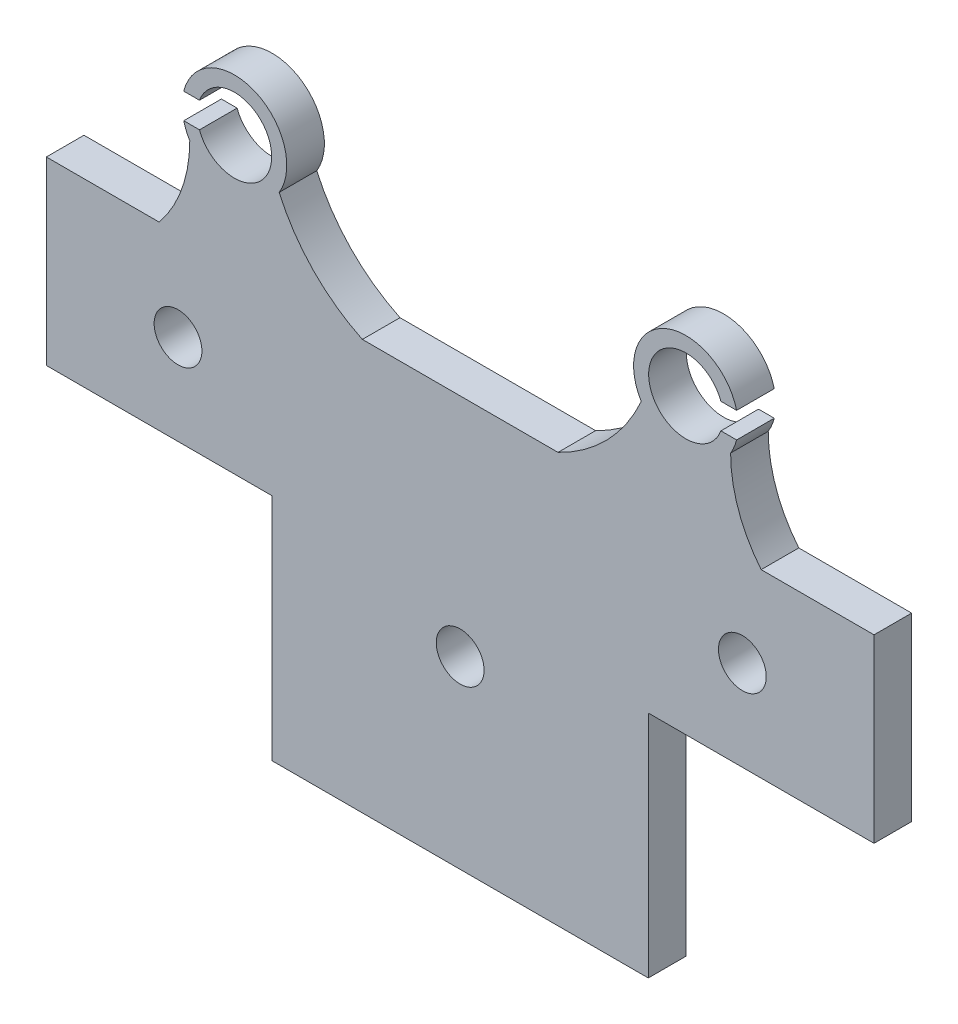
ISO-10303-21;
HEADER;
FILE_DESCRIPTION(('STEP AP214'),'2;1');
FILE_NAME('part.step','',(''),(''),'','','');
FILE_SCHEMA(('AUTOMOTIVE_DESIGN { 1 0 10303 214 1 1 1 1 }'));
ENDSEC;
DATA;
#1=APPLICATION_CONTEXT('core data for automotive mechanical design processes');
#2=APPLICATION_PROTOCOL_DEFINITION('international standard','automotive_design',2000,#1);
#3=PRODUCT_CONTEXT('',#1,'mechanical');
#4=PRODUCT('Part','Part','',(#3));
#5=PRODUCT_RELATED_PRODUCT_CATEGORY('part','',(#4));
#6=PRODUCT_DEFINITION_FORMATION('','',#4);
#7=PRODUCT_DEFINITION_CONTEXT('part definition',#1,'design');
#8=PRODUCT_DEFINITION('design','',#6,#7);
#9=PRODUCT_DEFINITION_SHAPE('','',#8);
#10=(LENGTH_UNIT() NAMED_UNIT(*) SI_UNIT(.MILLI.,.METRE.));
#11=(NAMED_UNIT(*) PLANE_ANGLE_UNIT() SI_UNIT($,.RADIAN.));
#12=(NAMED_UNIT(*) SI_UNIT($,.STERADIAN.) SOLID_ANGLE_UNIT());
#13=UNCERTAINTY_MEASURE_WITH_UNIT(LENGTH_MEASURE(1.E-05),#10,'distance_accuracy_value','');
#14=(GEOMETRIC_REPRESENTATION_CONTEXT(3) GLOBAL_UNCERTAINTY_ASSIGNED_CONTEXT((#13)) GLOBAL_UNIT_ASSIGNED_CONTEXT((#10,
#11,#12)) REPRESENTATION_CONTEXT('',''));
#15=CARTESIAN_POINT('',(0.,0.,0.));
#16=DIRECTION('',(0.,0.,1.));
#17=DIRECTION('',(1.,0.,0.));
#18=AXIS2_PLACEMENT_3D('',#15,#16,#17);
#19=CARTESIAN_POINT('',(53.9385104929325,11.3893777371026,5.));
#20=DIRECTION('',(0.,0.,1.));
#21=DIRECTION('',(1.,0.,0.));
#22=AXIS2_PLACEMENT_3D('',#19,#20,#21);
#23=PLANE('',#22);
#24=CARTESIAN_POINT('',(-37.5,-12.,5.));
#25=DIRECTION('',(0.,0.,1.));
#26=DIRECTION('',(1.,0.,0.));
#27=AXIS2_PLACEMENT_3D('',#24,#25,#26);
#28=CIRCLE('',#27,3.175);
#29=CARTESIAN_POINT('',(-34.325,-12.,5.));
#30=VERTEX_POINT('',#29);
#31=EDGE_CURVE('E329',#30,#30,#28,.T.);
#32=ORIENTED_EDGE('',*,*,#31,.F.);
#33=EDGE_LOOP('',(#32));
#34=FACE_BOUND('',#33,.T.);
#35=CARTESIAN_POINT('',(0.,-30.,5.));
#36=DIRECTION('',(0.,0.,1.));
#37=DIRECTION('',(1.,0.,0.));
#38=AXIS2_PLACEMENT_3D('',#35,#36,#37);
#39=CIRCLE('',#38,3.175);
#40=CARTESIAN_POINT('',(3.175,-30.,5.));
#41=VERTEX_POINT('',#40);
#42=EDGE_CURVE('E676',#41,#41,#39,.T.);
#43=ORIENTED_EDGE('',*,*,#42,.F.);
#44=EDGE_LOOP('',(#43));
#45=FACE_BOUND('',#44,.T.);
#46=CARTESIAN_POINT('',(37.5,-12.,5.));
#47=DIRECTION('',(0.,0.,1.));
#48=DIRECTION('',(-1.,0.,0.));
#49=AXIS2_PLACEMENT_3D('',#46,#47,#48);
#50=CIRCLE('',#49,3.175);
#51=CARTESIAN_POINT('',(34.325,-12.,5.));
#52=VERTEX_POINT('',#51);
#53=EDGE_CURVE('E666',#52,#52,#50,.T.);
#54=ORIENTED_EDGE('',*,*,#53,.F.);
#55=EDGE_LOOP('',(#54));
#56=FACE_BOUND('',#55,.T.);
#57=CARTESIAN_POINT('',(-30.,15.,5.));
#58=DIRECTION('',(0.,0.,1.));
#59=DIRECTION('',(1.,0.,0.));
#60=AXIS2_PLACEMENT_3D('',#57,#58,#59);
#61=CIRCLE('',#60,6.95);
#62=CARTESIAN_POINT('',(-24.0614895070675,11.3893777371027,5.));
#63=VERTEX_POINT('',#62);
#64=CARTESIAN_POINT('',(-36.738879728857,16.7,5.));
#65=VERTEX_POINT('',#64);
#66=EDGE_CURVE('E212',#63,#65,#61,.T.);
#67=ORIENTED_EDGE('',*,*,#66,.T.);
#68=DIRECTION('',(-1.,0.,0.));
#69=VECTOR('',#68,1.);
#70=CARTESIAN_POINT('',(-30.,16.7,5.));
#71=LINE('',#70,#69);
#72=CARTESIAN_POINT('',(-34.6489246068311,16.7,5.));
#73=VERTEX_POINT('',#72);
#74=EDGE_CURVE('E197',#73,#65,#71,.T.);
#75=ORIENTED_EDGE('',*,*,#74,.F.);
#76=CARTESIAN_POINT('',(-30.,15.,5.));
#77=DIRECTION('',(0.,0.,1.));
#78=DIRECTION('',(1.,0.,0.));
#79=AXIS2_PLACEMENT_3D('',#76,#77,#78);
#80=CIRCLE('',#79,4.95);
#81=CARTESIAN_POINT('',(-34.6489246068311,13.3,5.));
#82=VERTEX_POINT('',#81);
#83=EDGE_CURVE('E235',#82,#73,#80,.T.);
#84=ORIENTED_EDGE('',*,*,#83,.F.);
#85=DIRECTION('',(1.,0.,0.));
#86=VECTOR('',#85,1.);
#87=CARTESIAN_POINT('',(-30.,13.3,5.));
#88=LINE('',#87,#86);
#89=CARTESIAN_POINT('',(-36.738879728857,13.3,5.));
#90=VERTEX_POINT('',#89);
#91=EDGE_CURVE('E61',#90,#82,#88,.T.);
#92=ORIENTED_EDGE('',*,*,#91,.F.);
#93=CARTESIAN_POINT('',(-35.9385104929326,11.3893777371026,5.));
#94=VERTEX_POINT('',#93);
#95=EDGE_CURVE('E222',#90,#94,#61,.T.);
#96=ORIENTED_EDGE('',*,*,#95,.T.);
#97=CARTESIAN_POINT('',(-53.9385104929325,11.3893777371026,5.));
#98=DIRECTION('',(0.,0.,-1.));
#99=DIRECTION('',(-1.,0.,0.));
#100=AXIS2_PLACEMENT_3D('',#97,#98,#99);
#101=CIRCLE('',#100,18.);
#102=CARTESIAN_POINT('',(-40.,0.,5.));
#103=VERTEX_POINT('',#102);
#104=EDGE_CURVE('E221',#94,#103,#101,.T.);
#105=ORIENTED_EDGE('',*,*,#104,.T.);
#106=DIRECTION('',(-1.,0.,0.));
#107=VECTOR('',#106,1.);
#108=CARTESIAN_POINT('',(-40.,0.,5.));
#109=LINE('',#108,#107);
#110=CARTESIAN_POINT('',(-55.,0.,5.));
#111=VERTEX_POINT('',#110);
#112=EDGE_CURVE('E268',#103,#111,#109,.T.);
#113=ORIENTED_EDGE('',*,*,#112,.T.);
#114=DIRECTION('',(0.,-1.,0.));
#115=VECTOR('',#114,1.);
#116=CARTESIAN_POINT('',(-55.,0.,5.));
#117=LINE('',#116,#115);
#118=CARTESIAN_POINT('',(-55.,-24.,5.));
#119=VERTEX_POINT('',#118);
#120=EDGE_CURVE('E338',#111,#119,#117,.T.);
#121=ORIENTED_EDGE('',*,*,#120,.T.);
#122=DIRECTION('',(1.,0.,0.));
#123=VECTOR('',#122,1.);
#124=CARTESIAN_POINT('',(-55.,-24.,5.));
#125=LINE('',#124,#123);
#126=CARTESIAN_POINT('',(-25.,-24.,5.));
#127=VERTEX_POINT('',#126);
#128=EDGE_CURVE('E340',#119,#127,#125,.T.);
#129=ORIENTED_EDGE('',*,*,#128,.T.);
#130=DIRECTION('',(0.,-1.,0.));
#131=VECTOR('',#130,1.);
#132=CARTESIAN_POINT('',(-25.,-24.,5.));
#133=LINE('',#132,#131);
#134=CARTESIAN_POINT('',(-25.,-54.5,5.));
#135=VERTEX_POINT('',#134);
#136=EDGE_CURVE('E342',#127,#135,#133,.T.);
#137=ORIENTED_EDGE('',*,*,#136,.T.);
#138=DIRECTION('',(1.,0.,0.));
#139=VECTOR('',#138,1.);
#140=CARTESIAN_POINT('',(-25.,-54.5,5.));
#141=LINE('',#140,#139);
#142=CARTESIAN_POINT('',(25.,-54.5,5.));
#143=VERTEX_POINT('',#142);
#144=EDGE_CURVE('E345',#135,#143,#141,.T.);
#145=ORIENTED_EDGE('',*,*,#144,.T.);
#146=DIRECTION('',(0.,1.,0.));
#147=VECTOR('',#146,1.);
#148=CARTESIAN_POINT('',(25.,-24.,5.));
#149=LINE('',#148,#147);
#150=CARTESIAN_POINT('',(25.,-24.,5.));
#151=VERTEX_POINT('',#150);
#152=EDGE_CURVE('E347',#143,#151,#149,.T.);
#153=ORIENTED_EDGE('',*,*,#152,.T.);
#154=DIRECTION('',(1.,0.,0.));
#155=VECTOR('',#154,1.);
#156=CARTESIAN_POINT('',(55.,-24.,5.));
#157=LINE('',#156,#155);
#158=CARTESIAN_POINT('',(55.,-24.,5.));
#159=VERTEX_POINT('',#158);
#160=EDGE_CURVE('E350',#151,#159,#157,.T.);
#161=ORIENTED_EDGE('',*,*,#160,.T.);
#162=DIRECTION('',(0.,1.,0.));
#163=VECTOR('',#162,1.);
#164=CARTESIAN_POINT('',(55.,0.,5.));
#165=LINE('',#164,#163);
#166=CARTESIAN_POINT('',(55.,0.,5.));
#167=VERTEX_POINT('',#166);
#168=EDGE_CURVE('E352',#159,#167,#165,.T.);
#169=ORIENTED_EDGE('',*,*,#168,.T.);
#170=DIRECTION('',(-1.,0.,0.));
#171=VECTOR('',#170,1.);
#172=CARTESIAN_POINT('',(40.,0.,5.));
#173=LINE('',#172,#171);
#174=CARTESIAN_POINT('',(40.,0.,5.));
#175=VERTEX_POINT('',#174);
#176=EDGE_CURVE('E354',#167,#175,#173,.T.);
#177=ORIENTED_EDGE('',*,*,#176,.T.);
#178=CARTESIAN_POINT('',(53.9385104929325,11.3893777371026,5.));
#179=DIRECTION('',(0.,0.,-1.));
#180=DIRECTION('',(1.,0.,0.));
#181=AXIS2_PLACEMENT_3D('',#178,#179,#180);
#182=CIRCLE('',#181,18.);
#183=CARTESIAN_POINT('',(35.9385104929326,11.3893777371026,5.));
#184=VERTEX_POINT('',#183);
#185=EDGE_CURVE('E357',#175,#184,#182,.T.);
#186=ORIENTED_EDGE('',*,*,#185,.T.);
#187=CARTESIAN_POINT('',(30.,15.,5.));
#188=DIRECTION('',(0.,0.,1.));
#189=DIRECTION('',(-1.,0.,0.));
#190=AXIS2_PLACEMENT_3D('',#187,#188,#189);
#191=CIRCLE('',#190,6.95);
#192=CARTESIAN_POINT('',(36.738879728857,13.3,5.));
#193=VERTEX_POINT('',#192);
#194=EDGE_CURVE('E361',#184,#193,#191,.T.);
#195=ORIENTED_EDGE('',*,*,#194,.T.);
#196=DIRECTION('',(1.,0.,0.));
#197=VECTOR('',#196,1.);
#198=CARTESIAN_POINT('',(30.,13.3,5.));
#199=LINE('',#198,#197);
#200=CARTESIAN_POINT('',(34.6489246068311,13.3,5.));
#201=VERTEX_POINT('',#200);
#202=EDGE_CURVE('E621',#201,#193,#199,.T.);
#203=ORIENTED_EDGE('',*,*,#202,.F.);
#204=CARTESIAN_POINT('',(30.,15.,5.));
#205=DIRECTION('',(0.,0.,1.));
#206=DIRECTION('',(-1.,0.,0.));
#207=AXIS2_PLACEMENT_3D('',#204,#205,#206);
#208=CIRCLE('',#207,4.95);
#209=CARTESIAN_POINT('',(34.6489246068311,16.7,5.));
#210=VERTEX_POINT('',#209);
#211=EDGE_CURVE('E672',#210,#201,#208,.T.);
#212=ORIENTED_EDGE('',*,*,#211,.F.);
#213=DIRECTION('',(-1.,0.,0.));
#214=VECTOR('',#213,1.);
#215=CARTESIAN_POINT('',(30.,16.7,5.));
#216=LINE('',#215,#214);
#217=CARTESIAN_POINT('',(36.738879728857,16.7,5.));
#218=VERTEX_POINT('',#217);
#219=EDGE_CURVE('E655',#218,#210,#216,.T.);
#220=ORIENTED_EDGE('',*,*,#219,.F.);
#221=CARTESIAN_POINT('',(24.0614895070675,11.3893777371026,5.));
#222=VERTEX_POINT('',#221);
#223=EDGE_CURVE('E360',#218,#222,#191,.T.);
#224=ORIENTED_EDGE('',*,*,#223,.T.);
#225=CARTESIAN_POINT('',(3.04543692353487,20.7341909404895,5.));
#226=DIRECTION('',(0.,0.,-1.));
#227=DIRECTION('',(-1.,0.,0.));
#228=AXIS2_PLACEMENT_3D('',#225,#226,#227);
#229=CIRCLE('',#228,23.);
#230=CARTESIAN_POINT('',(13.,0.,5.));
#231=VERTEX_POINT('',#230);
#232=EDGE_CURVE('E365',#222,#231,#229,.T.);
#233=ORIENTED_EDGE('',*,*,#232,.T.);
#234=DIRECTION('',(-1.,0.,0.));
#235=VECTOR('',#234,1.);
#236=CARTESIAN_POINT('',(13.,0.,5.));
#237=LINE('',#236,#235);
#238=CARTESIAN_POINT('',(-13.,0.,5.));
#239=VERTEX_POINT('',#238);
#240=EDGE_CURVE('E367',#231,#239,#237,.T.);
#241=ORIENTED_EDGE('',*,*,#240,.T.);
#242=CARTESIAN_POINT('',(-3.04543692353487,20.7341909404895,5.));
#243=DIRECTION('',(0.,0.,-1.));
#244=DIRECTION('',(1.,0.,0.));
#245=AXIS2_PLACEMENT_3D('',#242,#243,#244);
#246=CIRCLE('',#245,23.);
#247=EDGE_CURVE('E219',#239,#63,#246,.T.);
#248=ORIENTED_EDGE('',*,*,#247,.T.);
#249=EDGE_LOOP('',(#67,#75,#84,#92,#96,#105,#113,#121,#129,#137,#145,#153,#161,#169,#177,#186,
#195,#203,#212,#220,#224,#233,#241,#248));
#250=FACE_BOUND('',#249,.T.);
#251=ADVANCED_FACE('F39',(#34,#45,#56,#250),#23,.T.);
#252=CARTESIAN_POINT('',(53.9385104929325,11.3893777371026,0.));
#253=DIRECTION('',(0.,0.,1.));
#254=DIRECTION('',(1.,0.,0.));
#255=AXIS2_PLACEMENT_3D('',#252,#253,#254);
#256=PLANE('',#255);
#257=CARTESIAN_POINT('',(-37.5,-12.,0.));
#258=DIRECTION('',(0.,0.,1.));
#259=DIRECTION('',(1.,0.,0.));
#260=AXIS2_PLACEMENT_3D('',#257,#258,#259);
#261=CIRCLE('',#260,3.175);
#262=CARTESIAN_POINT('',(-34.325,-12.,0.));
#263=VERTEX_POINT('',#262);
#264=EDGE_CURVE('E332',#263,#263,#261,.T.);
#265=ORIENTED_EDGE('',*,*,#264,.T.);
#266=EDGE_LOOP('',(#265));
#267=FACE_BOUND('',#266,.T.);
#268=CARTESIAN_POINT('',(0.,-30.,0.));
#269=DIRECTION('',(0.,0.,1.));
#270=DIRECTION('',(1.,0.,0.));
#271=AXIS2_PLACEMENT_3D('',#268,#269,#270);
#272=CIRCLE('',#271,3.175);
#273=CARTESIAN_POINT('',(3.175,-30.,0.));
#274=VERTEX_POINT('',#273);
#275=EDGE_CURVE('E674',#274,#274,#272,.T.);
#276=ORIENTED_EDGE('',*,*,#275,.T.);
#277=EDGE_LOOP('',(#276));
#278=FACE_BOUND('',#277,.T.);
#279=CARTESIAN_POINT('',(37.5,-12.,0.));
#280=DIRECTION('',(0.,0.,1.));
#281=DIRECTION('',(-1.,0.,0.));
#282=AXIS2_PLACEMENT_3D('',#279,#280,#281);
#283=CIRCLE('',#282,3.175);
#284=CARTESIAN_POINT('',(34.325,-12.,0.));
#285=VERTEX_POINT('',#284);
#286=EDGE_CURVE('E215',#285,#285,#283,.T.);
#287=ORIENTED_EDGE('',*,*,#286,.T.);
#288=EDGE_LOOP('',(#287));
#289=FACE_BOUND('',#288,.T.);
#290=DIRECTION('',(-1.,0.,0.));
#291=VECTOR('',#290,1.);
#292=CARTESIAN_POINT('',(-30.,16.7,0.));
#293=LINE('',#292,#291);
#294=CARTESIAN_POINT('',(-34.6489246068311,16.7,0.));
#295=VERTEX_POINT('',#294);
#296=CARTESIAN_POINT('',(-36.738879728857,16.7,0.));
#297=VERTEX_POINT('',#296);
#298=EDGE_CURVE('E54',#295,#297,#293,.T.);
#299=ORIENTED_EDGE('',*,*,#298,.T.);
#300=CARTESIAN_POINT('',(-30.,15.,0.));
#301=DIRECTION('',(0.,0.,1.));
#302=DIRECTION('',(1.,0.,0.));
#303=AXIS2_PLACEMENT_3D('',#300,#301,#302);
#304=CIRCLE('',#303,6.95);
#305=CARTESIAN_POINT('',(-24.0614895070675,11.3893777371027,0.));
#306=VERTEX_POINT('',#305);
#307=EDGE_CURVE('E214',#306,#297,#304,.T.);
#308=ORIENTED_EDGE('',*,*,#307,.F.);
#309=CARTESIAN_POINT('',(-3.04543692353487,20.7341909404895,0.));
#310=DIRECTION('',(0.,0.,-1.));
#311=DIRECTION('',(1.,0.,0.));
#312=AXIS2_PLACEMENT_3D('',#309,#310,#311);
#313=CIRCLE('',#312,23.);
#314=CARTESIAN_POINT('',(-13.,0.,0.));
#315=VERTEX_POINT('',#314);
#316=EDGE_CURVE('E262',#315,#306,#313,.T.);
#317=ORIENTED_EDGE('',*,*,#316,.F.);
#318=DIRECTION('',(-1.,0.,0.));
#319=VECTOR('',#318,1.);
#320=CARTESIAN_POINT('',(13.,0.,0.));
#321=LINE('',#320,#319);
#322=CARTESIAN_POINT('',(13.,0.,0.));
#323=VERTEX_POINT('',#322);
#324=EDGE_CURVE('E260',#323,#315,#321,.T.);
#325=ORIENTED_EDGE('',*,*,#324,.F.);
#326=CARTESIAN_POINT('',(3.04543692353487,20.7341909404895,0.));
#327=DIRECTION('',(0.,0.,-1.));
#328=DIRECTION('',(-1.,0.,0.));
#329=AXIS2_PLACEMENT_3D('',#326,#327,#328);
#330=CIRCLE('',#329,23.);
#331=CARTESIAN_POINT('',(24.0614895070675,11.3893777371026,0.));
#332=VERTEX_POINT('',#331);
#333=EDGE_CURVE('E258',#332,#323,#330,.T.);
#334=ORIENTED_EDGE('',*,*,#333,.F.);
#335=CARTESIAN_POINT('',(30.,15.,0.));
#336=DIRECTION('',(0.,0.,1.));
#337=DIRECTION('',(-1.,0.,0.));
#338=AXIS2_PLACEMENT_3D('',#335,#336,#337);
#339=CIRCLE('',#338,6.95);
#340=CARTESIAN_POINT('',(36.738879728857,16.7,0.));
#341=VERTEX_POINT('',#340);
#342=EDGE_CURVE('E253',#341,#332,#339,.T.);
#343=ORIENTED_EDGE('',*,*,#342,.F.);
#344=DIRECTION('',(-1.,0.,0.));
#345=VECTOR('',#344,1.);
#346=CARTESIAN_POINT('',(30.,16.7,0.));
#347=LINE('',#346,#345);
#348=CARTESIAN_POINT('',(34.6489246068311,16.7,0.));
#349=VERTEX_POINT('',#348);
#350=EDGE_CURVE('E659',#341,#349,#347,.T.);
#351=ORIENTED_EDGE('',*,*,#350,.T.);
#352=CARTESIAN_POINT('',(30.,15.,0.));
#353=DIRECTION('',(0.,0.,1.));
#354=DIRECTION('',(-1.,0.,0.));
#355=AXIS2_PLACEMENT_3D('',#352,#353,#354);
#356=CIRCLE('',#355,4.95);
#357=CARTESIAN_POINT('',(34.6489246068311,13.3,0.));
#358=VERTEX_POINT('',#357);
#359=EDGE_CURVE('E669',#349,#358,#356,.T.);
#360=ORIENTED_EDGE('',*,*,#359,.T.);
#361=DIRECTION('',(1.,0.,0.));
#362=VECTOR('',#361,1.);
#363=CARTESIAN_POINT('',(30.,13.3,0.));
#364=LINE('',#363,#362);
#365=CARTESIAN_POINT('',(36.738879728857,13.3,0.));
#366=VERTEX_POINT('',#365);
#367=EDGE_CURVE('E615',#358,#366,#364,.T.);
#368=ORIENTED_EDGE('',*,*,#367,.T.);
#369=CARTESIAN_POINT('',(35.9385104929326,11.3893777371026,0.));
#370=VERTEX_POINT('',#369);
#371=EDGE_CURVE('E254',#370,#366,#339,.T.);
#372=ORIENTED_EDGE('',*,*,#371,.F.);
#373=CARTESIAN_POINT('',(53.9385104929325,11.3893777371026,0.));
#374=DIRECTION('',(0.,0.,-1.));
#375=DIRECTION('',(1.,0.,0.));
#376=AXIS2_PLACEMENT_3D('',#373,#374,#375);
#377=CIRCLE('',#376,18.);
#378=CARTESIAN_POINT('',(40.,0.,0.));
#379=VERTEX_POINT('',#378);
#380=EDGE_CURVE('E251',#379,#370,#377,.T.);
#381=ORIENTED_EDGE('',*,*,#380,.F.);
#382=DIRECTION('',(-1.,0.,0.));
#383=VECTOR('',#382,1.);
#384=CARTESIAN_POINT('',(40.,0.,0.));
#385=LINE('',#384,#383);
#386=CARTESIAN_POINT('',(55.,0.,0.));
#387=VERTEX_POINT('',#386);
#388=EDGE_CURVE('E249',#387,#379,#385,.T.);
#389=ORIENTED_EDGE('',*,*,#388,.F.);
#390=DIRECTION('',(0.,1.,0.));
#391=VECTOR('',#390,1.);
#392=CARTESIAN_POINT('',(55.,0.,0.));
#393=LINE('',#392,#391);
#394=CARTESIAN_POINT('',(55.,-24.,0.));
#395=VERTEX_POINT('',#394);
#396=EDGE_CURVE('E247',#395,#387,#393,.T.);
#397=ORIENTED_EDGE('',*,*,#396,.F.);
#398=DIRECTION('',(1.,0.,0.));
#399=VECTOR('',#398,1.);
#400=CARTESIAN_POINT('',(55.,-24.,0.));
#401=LINE('',#400,#399);
#402=CARTESIAN_POINT('',(25.,-24.,0.));
#403=VERTEX_POINT('',#402);
#404=EDGE_CURVE('E245',#403,#395,#401,.T.);
#405=ORIENTED_EDGE('',*,*,#404,.F.);
#406=DIRECTION('',(0.,1.,0.));
#407=VECTOR('',#406,1.);
#408=CARTESIAN_POINT('',(25.,-24.,0.));
#409=LINE('',#408,#407);
#410=CARTESIAN_POINT('',(25.,-54.5,0.));
#411=VERTEX_POINT('',#410);
#412=EDGE_CURVE('E243',#411,#403,#409,.T.);
#413=ORIENTED_EDGE('',*,*,#412,.F.);
#414=DIRECTION('',(1.,0.,0.));
#415=VECTOR('',#414,1.);
#416=CARTESIAN_POINT('',(-25.,-54.5,0.));
#417=LINE('',#416,#415);
#418=CARTESIAN_POINT('',(-25.,-54.5,0.));
#419=VERTEX_POINT('',#418);
#420=EDGE_CURVE('E241',#419,#411,#417,.T.);
#421=ORIENTED_EDGE('',*,*,#420,.F.);
#422=DIRECTION('',(0.,-1.,0.));
#423=VECTOR('',#422,1.);
#424=CARTESIAN_POINT('',(-25.,-24.,0.));
#425=LINE('',#424,#423);
#426=CARTESIAN_POINT('',(-25.,-24.,0.));
#427=VERTEX_POINT('',#426);
#428=EDGE_CURVE('E239',#427,#419,#425,.T.);
#429=ORIENTED_EDGE('',*,*,#428,.F.);
#430=DIRECTION('',(1.,0.,0.));
#431=VECTOR('',#430,1.);
#432=CARTESIAN_POINT('',(-55.,-24.,0.));
#433=LINE('',#432,#431);
#434=CARTESIAN_POINT('',(-55.,-24.,0.));
#435=VERTEX_POINT('',#434);
#436=EDGE_CURVE('E237',#435,#427,#433,.T.);
#437=ORIENTED_EDGE('',*,*,#436,.F.);
#438=DIRECTION('',(0.,-1.,0.));
#439=VECTOR('',#438,1.);
#440=CARTESIAN_POINT('',(-55.,0.,0.));
#441=LINE('',#440,#439);
#442=CARTESIAN_POINT('',(-55.,0.,0.));
#443=VERTEX_POINT('',#442);
#444=EDGE_CURVE('E234',#443,#435,#441,.T.);
#445=ORIENTED_EDGE('',*,*,#444,.F.);
#446=DIRECTION('',(-1.,0.,0.));
#447=VECTOR('',#446,1.);
#448=CARTESIAN_POINT('',(-40.,0.,0.));
#449=LINE('',#448,#447);
#450=CARTESIAN_POINT('',(-40.,0.,0.));
#451=VERTEX_POINT('',#450);
#452=EDGE_CURVE('E230',#451,#443,#449,.T.);
#453=ORIENTED_EDGE('',*,*,#452,.F.);
#454=CARTESIAN_POINT('',(-53.9385104929325,11.3893777371026,0.));
#455=DIRECTION('',(0.,0.,-1.));
#456=DIRECTION('',(-1.,0.,0.));
#457=AXIS2_PLACEMENT_3D('',#454,#455,#456);
#458=CIRCLE('',#457,18.);
#459=CARTESIAN_POINT('',(-35.9385104929326,11.3893777371026,0.));
#460=VERTEX_POINT('',#459);
#461=EDGE_CURVE('E266',#460,#451,#458,.T.);
#462=ORIENTED_EDGE('',*,*,#461,.F.);
#463=CARTESIAN_POINT('',(-36.738879728857,13.3,0.));
#464=VERTEX_POINT('',#463);
#465=EDGE_CURVE('E264',#464,#460,#304,.T.);
#466=ORIENTED_EDGE('',*,*,#465,.F.);
#467=DIRECTION('',(1.,0.,0.));
#468=VECTOR('',#467,1.);
#469=CARTESIAN_POINT('',(-30.,13.3,0.));
#470=LINE('',#469,#468);
#471=CARTESIAN_POINT('',(-34.6489246068311,13.3,0.));
#472=VERTEX_POINT('',#471);
#473=EDGE_CURVE('E205',#464,#472,#470,.T.);
#474=ORIENTED_EDGE('',*,*,#473,.T.);
#475=CARTESIAN_POINT('',(-30.,15.,0.));
#476=DIRECTION('',(0.,0.,1.));
#477=DIRECTION('',(1.,0.,0.));
#478=AXIS2_PLACEMENT_3D('',#475,#476,#477);
#479=CIRCLE('',#478,4.95);
#480=EDGE_CURVE('E325',#472,#295,#479,.T.);
#481=ORIENTED_EDGE('',*,*,#480,.T.);
#482=EDGE_LOOP('',(#299,#308,#317,#325,#334,#343,#351,#360,#368,#372,#381,#389,#397,#405,#413,
#421,#429,#437,#445,#453,#462,#466,#474,#481));
#483=FACE_BOUND('',#482,.T.);
#484=ADVANCED_FACE('F518',(#267,#278,#289,#483),#256,.F.);
#485=CARTESIAN_POINT('',(30.,15.,5.));
#486=DIRECTION('',(0.,0.,-1.));
#487=DIRECTION('',(-1.,0.,0.));
#488=AXIS2_PLACEMENT_3D('',#485,#486,#487);
#489=CYLINDRICAL_SURFACE('',#488,6.95);
#490=DIRECTION('',(0.,0.,-1.));
#491=VECTOR('',#490,1.);
#492=CARTESIAN_POINT('',(36.738879728857,16.7,5.));
#493=LINE('',#492,#491);
#494=EDGE_CURVE('E658',#218,#341,#493,.T.);
#495=ORIENTED_EDGE('',*,*,#494,.T.);
#496=ORIENTED_EDGE('',*,*,#342,.T.);
#497=DIRECTION('',(0.,0.,-1.));
#498=VECTOR('',#497,1.);
#499=CARTESIAN_POINT('',(24.0614895070675,11.3893777371026,5.));
#500=LINE('',#499,#498);
#501=EDGE_CURVE('E283',#222,#332,#500,.T.);
#502=ORIENTED_EDGE('',*,*,#501,.F.);
#503=ORIENTED_EDGE('',*,*,#223,.F.);
#504=EDGE_LOOP('',(#495,#496,#502,#503));
#505=FACE_BOUND('',#504,.T.);
#506=ADVANCED_FACE('F459',(#505),#489,.T.);
#507=DIRECTION('',(0.,0.,-1.));
#508=VECTOR('',#507,1.);
#509=CARTESIAN_POINT('',(36.738879728857,13.3,5.));
#510=LINE('',#509,#508);
#511=EDGE_CURVE('E618',#193,#366,#510,.T.);
#512=ORIENTED_EDGE('',*,*,#511,.F.);
#513=ORIENTED_EDGE('',*,*,#194,.F.);
#514=DIRECTION('',(0.,0.,-1.));
#515=VECTOR('',#514,1.);
#516=CARTESIAN_POINT('',(35.9385104929326,11.3893777371026,5.));
#517=LINE('',#516,#515);
#518=EDGE_CURVE('E286',#184,#370,#517,.T.);
#519=ORIENTED_EDGE('',*,*,#518,.T.);
#520=ORIENTED_EDGE('',*,*,#371,.T.);
#521=EDGE_LOOP('',(#512,#513,#519,#520));
#522=FACE_BOUND('',#521,.T.);
#523=ADVANCED_FACE('F455',(#522),#489,.T.);
#524=CARTESIAN_POINT('',(-30.,15.,5.));
#525=DIRECTION('',(0.,0.,-1.));
#526=DIRECTION('',(-1.,0.,0.));
#527=AXIS2_PLACEMENT_3D('',#524,#525,#526);
#528=CYLINDRICAL_SURFACE('',#527,6.95);
#529=DIRECTION('',(0.,0.,-1.));
#530=VECTOR('',#529,1.);
#531=CARTESIAN_POINT('',(-36.738879728857,16.7,5.));
#532=LINE('',#531,#530);
#533=EDGE_CURVE('E200',#65,#297,#532,.T.);
#534=ORIENTED_EDGE('',*,*,#533,.F.);
#535=ORIENTED_EDGE('',*,*,#66,.F.);
#536=DIRECTION('',(0.,0.,-1.));
#537=VECTOR('',#536,1.);
#538=CARTESIAN_POINT('',(-24.0614895070675,11.3893777371027,5.));
#539=LINE('',#538,#537);
#540=EDGE_CURVE('E274',#63,#306,#539,.T.);
#541=ORIENTED_EDGE('',*,*,#540,.T.);
#542=ORIENTED_EDGE('',*,*,#307,.T.);
#543=EDGE_LOOP('',(#534,#535,#541,#542));
#544=FACE_BOUND('',#543,.T.);
#545=ADVANCED_FACE('F210',(#544),#528,.T.);
#546=DIRECTION('',(0.,0.,-1.));
#547=VECTOR('',#546,1.);
#548=CARTESIAN_POINT('',(-36.738879728857,13.3,5.));
#549=LINE('',#548,#547);
#550=EDGE_CURVE('E216',#90,#464,#549,.T.);
#551=ORIENTED_EDGE('',*,*,#550,.T.);
#552=ORIENTED_EDGE('',*,*,#465,.T.);
#553=DIRECTION('',(0.,0.,-1.));
#554=VECTOR('',#553,1.);
#555=CARTESIAN_POINT('',(-35.9385104929326,11.3893777371026,5.));
#556=LINE('',#555,#554);
#557=EDGE_CURVE('E271',#94,#460,#556,.T.);
#558=ORIENTED_EDGE('',*,*,#557,.F.);
#559=ORIENTED_EDGE('',*,*,#95,.F.);
#560=EDGE_LOOP('',(#551,#552,#558,#559));
#561=FACE_BOUND('',#560,.T.);
#562=ADVANCED_FACE('F579',(#561),#528,.T.);
#563=CARTESIAN_POINT('',(-30.,15.,5.));
#564=DIRECTION('',(0.,0.,-1.));
#565=DIRECTION('',(-1.,0.,0.));
#566=AXIS2_PLACEMENT_3D('',#563,#564,#565);
#567=CYLINDRICAL_SURFACE('',#566,4.95);
#568=ORIENTED_EDGE('',*,*,#83,.T.);
#569=DIRECTION('',(0.,0.,-1.));
#570=VECTOR('',#569,1.);
#571=CARTESIAN_POINT('',(-34.6489246068311,16.7,5.));
#572=LINE('',#571,#570);
#573=EDGE_CURVE('E11',#73,#295,#572,.T.);
#574=ORIENTED_EDGE('',*,*,#573,.T.);
#575=ORIENTED_EDGE('',*,*,#480,.F.);
#576=DIRECTION('',(0.,0.,-1.));
#577=VECTOR('',#576,1.);
#578=CARTESIAN_POINT('',(-34.6489246068311,13.3,5.));
#579=LINE('',#578,#577);
#580=EDGE_CURVE('E47',#472,#82,#579,.F.);
#581=ORIENTED_EDGE('',*,*,#580,.T.);
#582=EDGE_LOOP('',(#568,#574,#575,#581));
#583=FACE_BOUND('',#582,.T.);
#584=ADVANCED_FACE('F323',(#583),#567,.F.);
#585=CARTESIAN_POINT('',(30.,15.,5.));
#586=DIRECTION('',(0.,0.,-1.));
#587=DIRECTION('',(-1.,0.,0.));
#588=AXIS2_PLACEMENT_3D('',#585,#586,#587);
#589=CYLINDRICAL_SURFACE('',#588,4.95);
#590=ORIENTED_EDGE('',*,*,#359,.F.);
#591=DIRECTION('',(0.,0.,-1.));
#592=VECTOR('',#591,1.);
#593=CARTESIAN_POINT('',(34.6489246068311,16.7,5.));
#594=LINE('',#593,#592);
#595=EDGE_CURVE('E319',#349,#210,#594,.F.);
#596=ORIENTED_EDGE('',*,*,#595,.T.);
#597=ORIENTED_EDGE('',*,*,#211,.T.);
#598=DIRECTION('',(0.,0.,-1.));
#599=VECTOR('',#598,1.);
#600=CARTESIAN_POINT('',(34.6489246068311,13.3,5.));
#601=LINE('',#600,#599);
#602=EDGE_CURVE('E316',#201,#358,#601,.T.);
#603=ORIENTED_EDGE('',*,*,#602,.T.);
#604=EDGE_LOOP('',(#590,#596,#597,#603));
#605=FACE_BOUND('',#604,.T.);
#606=ADVANCED_FACE('F473',(#605),#589,.F.);
#607=CARTESIAN_POINT('',(-40.,0.,5.));
#608=DIRECTION('',(0.,-1.,0.));
#609=DIRECTION('',(1.,0.,0.));
#610=AXIS2_PLACEMENT_3D('',#607,#608,#609);
#611=PLANE('',#610);
#612=ORIENTED_EDGE('',*,*,#452,.T.);
#613=DIRECTION('',(0.,0.,-1.));
#614=VECTOR('',#613,1.);
#615=CARTESIAN_POINT('',(-55.,0.,5.));
#616=LINE('',#615,#614);
#617=EDGE_CURVE('E313',#111,#443,#616,.T.);
#618=ORIENTED_EDGE('',*,*,#617,.F.);
#619=ORIENTED_EDGE('',*,*,#112,.F.);
#620=DIRECTION('',(0.,0.,-1.));
#621=VECTOR('',#620,1.);
#622=CARTESIAN_POINT('',(-40.,0.,5.));
#623=LINE('',#622,#621);
#624=EDGE_CURVE('E225',#103,#451,#623,.T.);
#625=ORIENTED_EDGE('',*,*,#624,.T.);
#626=EDGE_LOOP('',(#612,#618,#619,#625));
#627=FACE_BOUND('',#626,.T.);
#628=ADVANCED_FACE('F41',(#627),#611,.F.);
#629=CARTESIAN_POINT('',(-55.,0.,5.));
#630=DIRECTION('',(1.,0.,0.));
#631=DIRECTION('',(0.,0.,-1.));
#632=AXIS2_PLACEMENT_3D('',#629,#630,#631);
#633=PLANE('',#632);
#634=ORIENTED_EDGE('',*,*,#444,.T.);
#635=DIRECTION('',(0.,0.,-1.));
#636=VECTOR('',#635,1.);
#637=CARTESIAN_POINT('',(-55.,-24.,5.));
#638=LINE('',#637,#636);
#639=EDGE_CURVE('E310',#119,#435,#638,.T.);
#640=ORIENTED_EDGE('',*,*,#639,.F.);
#641=ORIENTED_EDGE('',*,*,#120,.F.);
#642=ORIENTED_EDGE('',*,*,#617,.T.);
#643=EDGE_LOOP('',(#634,#640,#641,#642));
#644=FACE_BOUND('',#643,.T.);
#645=ADVANCED_FACE('F415',(#644),#633,.F.);
#646=CARTESIAN_POINT('',(-55.,-24.,5.));
#647=DIRECTION('',(0.,1.,0.));
#648=DIRECTION('',(0.,0.,1.));
#649=AXIS2_PLACEMENT_3D('',#646,#647,#648);
#650=PLANE('',#649);
#651=ORIENTED_EDGE('',*,*,#436,.T.);
#652=DIRECTION('',(0.,0.,-1.));
#653=VECTOR('',#652,1.);
#654=CARTESIAN_POINT('',(-25.,-24.,5.));
#655=LINE('',#654,#653);
#656=EDGE_CURVE('E307',#127,#427,#655,.T.);
#657=ORIENTED_EDGE('',*,*,#656,.F.);
#658=ORIENTED_EDGE('',*,*,#128,.F.);
#659=ORIENTED_EDGE('',*,*,#639,.T.);
#660=EDGE_LOOP('',(#651,#657,#658,#659));
#661=FACE_BOUND('',#660,.T.);
#662=ADVANCED_FACE('F420',(#661),#650,.F.);
#663=CARTESIAN_POINT('',(-25.,-24.,5.));
#664=DIRECTION('',(1.,0.,0.));
#665=DIRECTION('',(0.,1.,0.));
#666=AXIS2_PLACEMENT_3D('',#663,#664,#665);
#667=PLANE('',#666);
#668=ORIENTED_EDGE('',*,*,#428,.T.);
#669=DIRECTION('',(0.,0.,-1.));
#670=VECTOR('',#669,1.);
#671=CARTESIAN_POINT('',(-25.,-54.5,5.));
#672=LINE('',#671,#670);
#673=EDGE_CURVE('E304',#135,#419,#672,.T.);
#674=ORIENTED_EDGE('',*,*,#673,.F.);
#675=ORIENTED_EDGE('',*,*,#136,.F.);
#676=ORIENTED_EDGE('',*,*,#656,.T.);
#677=EDGE_LOOP('',(#668,#674,#675,#676));
#678=FACE_BOUND('',#677,.T.);
#679=ADVANCED_FACE('F431',(#678),#667,.F.);
#680=CARTESIAN_POINT('',(-25.,-54.5,5.));
#681=DIRECTION('',(0.,1.,0.));
#682=DIRECTION('',(0.,0.,1.));
#683=AXIS2_PLACEMENT_3D('',#680,#681,#682);
#684=PLANE('',#683);
#685=ORIENTED_EDGE('',*,*,#420,.T.);
#686=DIRECTION('',(0.,0.,-1.));
#687=VECTOR('',#686,1.);
#688=CARTESIAN_POINT('',(25.,-54.5,5.));
#689=LINE('',#688,#687);
#690=EDGE_CURVE('E301',#143,#411,#689,.T.);
#691=ORIENTED_EDGE('',*,*,#690,.F.);
#692=ORIENTED_EDGE('',*,*,#144,.F.);
#693=ORIENTED_EDGE('',*,*,#673,.T.);
#694=EDGE_LOOP('',(#685,#691,#692,#693));
#695=FACE_BOUND('',#694,.T.);
#696=ADVANCED_FACE('F407',(#695),#684,.F.);
#697=CARTESIAN_POINT('',(25.,-24.,5.));
#698=DIRECTION('',(-1.,0.,0.));
#699=DIRECTION('',(0.,-1.,0.));
#700=AXIS2_PLACEMENT_3D('',#697,#698,#699);
#701=PLANE('',#700);
#702=ORIENTED_EDGE('',*,*,#412,.T.);
#703=DIRECTION('',(0.,0.,-1.));
#704=VECTOR('',#703,1.);
#705=CARTESIAN_POINT('',(25.,-24.,5.));
#706=LINE('',#705,#704);
#707=EDGE_CURVE('E298',#151,#403,#706,.T.);
#708=ORIENTED_EDGE('',*,*,#707,.F.);
#709=ORIENTED_EDGE('',*,*,#152,.F.);
#710=ORIENTED_EDGE('',*,*,#690,.T.);
#711=EDGE_LOOP('',(#702,#708,#709,#710));
#712=FACE_BOUND('',#711,.T.);
#713=ADVANCED_FACE('F397',(#712),#701,.F.);
#714=CARTESIAN_POINT('',(55.,-24.,5.));
#715=DIRECTION('',(0.,1.,0.));
#716=DIRECTION('',(0.,0.,1.));
#717=AXIS2_PLACEMENT_3D('',#714,#715,#716);
#718=PLANE('',#717);
#719=ORIENTED_EDGE('',*,*,#404,.T.);
#720=DIRECTION('',(0.,0.,-1.));
#721=VECTOR('',#720,1.);
#722=CARTESIAN_POINT('',(55.,-24.,5.));
#723=LINE('',#722,#721);
#724=EDGE_CURVE('E295',#159,#395,#723,.T.);
#725=ORIENTED_EDGE('',*,*,#724,.F.);
#726=ORIENTED_EDGE('',*,*,#160,.F.);
#727=ORIENTED_EDGE('',*,*,#707,.T.);
#728=EDGE_LOOP('',(#719,#725,#726,#727));
#729=FACE_BOUND('',#728,.T.);
#730=ADVANCED_FACE('F385',(#729),#718,.F.);
#731=CARTESIAN_POINT('',(55.,0.,5.));
#732=DIRECTION('',(-1.,0.,0.));
#733=DIRECTION('',(0.,0.,1.));
#734=AXIS2_PLACEMENT_3D('',#731,#732,#733);
#735=PLANE('',#734);
#736=ORIENTED_EDGE('',*,*,#396,.T.);
#737=DIRECTION('',(0.,0.,-1.));
#738=VECTOR('',#737,1.);
#739=CARTESIAN_POINT('',(55.,0.,5.));
#740=LINE('',#739,#738);
#741=EDGE_CURVE('E292',#167,#387,#740,.T.);
#742=ORIENTED_EDGE('',*,*,#741,.F.);
#743=ORIENTED_EDGE('',*,*,#168,.F.);
#744=ORIENTED_EDGE('',*,*,#724,.T.);
#745=EDGE_LOOP('',(#736,#742,#743,#744));
#746=FACE_BOUND('',#745,.T.);
#747=ADVANCED_FACE('F379',(#746),#735,.F.);
#748=CARTESIAN_POINT('',(40.,0.,5.));
#749=DIRECTION('',(0.,-1.,0.));
#750=DIRECTION('',(1.,0.,0.));
#751=AXIS2_PLACEMENT_3D('',#748,#749,#750);
#752=PLANE('',#751);
#753=ORIENTED_EDGE('',*,*,#388,.T.);
#754=DIRECTION('',(0.,0.,-1.));
#755=VECTOR('',#754,1.);
#756=CARTESIAN_POINT('',(40.,0.,5.));
#757=LINE('',#756,#755);
#758=EDGE_CURVE('E289',#175,#379,#757,.T.);
#759=ORIENTED_EDGE('',*,*,#758,.F.);
#760=ORIENTED_EDGE('',*,*,#176,.F.);
#761=ORIENTED_EDGE('',*,*,#741,.T.);
#762=EDGE_LOOP('',(#753,#759,#760,#761));
#763=FACE_BOUND('',#762,.T.);
#764=ADVANCED_FACE('F384',(#763),#752,.F.);
#765=CARTESIAN_POINT('',(53.9385104929325,11.3893777371026,5.));
#766=DIRECTION('',(0.,0.,-1.));
#767=DIRECTION('',(-1.,0.,0.));
#768=AXIS2_PLACEMENT_3D('',#765,#766,#767);
#769=CYLINDRICAL_SURFACE('',#768,18.);
#770=ORIENTED_EDGE('',*,*,#380,.T.);
#771=ORIENTED_EDGE('',*,*,#518,.F.);
#772=ORIENTED_EDGE('',*,*,#185,.F.);
#773=ORIENTED_EDGE('',*,*,#758,.T.);
#774=EDGE_LOOP('',(#770,#771,#772,#773));
#775=FACE_BOUND('',#774,.T.);
#776=ADVANCED_FACE('F594',(#775),#769,.F.);
#777=CARTESIAN_POINT('',(3.04543692353487,20.7341909404895,5.));
#778=DIRECTION('',(0.,0.,-1.));
#779=DIRECTION('',(-1.,0.,0.));
#780=AXIS2_PLACEMENT_3D('',#777,#778,#779);
#781=CYLINDRICAL_SURFACE('',#780,23.);
#782=ORIENTED_EDGE('',*,*,#333,.T.);
#783=DIRECTION('',(0.,0.,-1.));
#784=VECTOR('',#783,1.);
#785=CARTESIAN_POINT('',(13.,0.,5.));
#786=LINE('',#785,#784);
#787=EDGE_CURVE('E279',#231,#323,#786,.T.);
#788=ORIENTED_EDGE('',*,*,#787,.F.);
#789=ORIENTED_EDGE('',*,*,#232,.F.);
#790=ORIENTED_EDGE('',*,*,#501,.T.);
#791=EDGE_LOOP('',(#782,#788,#789,#790));
#792=FACE_BOUND('',#791,.T.);
#793=ADVANCED_FACE('F591',(#792),#781,.F.);
#794=CARTESIAN_POINT('',(13.,0.,5.));
#795=DIRECTION('',(0.,-1.,0.));
#796=DIRECTION('',(0.,0.,-1.));
#797=AXIS2_PLACEMENT_3D('',#794,#795,#796);
#798=PLANE('',#797);
#799=ORIENTED_EDGE('',*,*,#324,.T.);
#800=DIRECTION('',(0.,0.,-1.));
#801=VECTOR('',#800,1.);
#802=CARTESIAN_POINT('',(-13.,0.,5.));
#803=LINE('',#802,#801);
#804=EDGE_CURVE('E276',#239,#315,#803,.T.);
#805=ORIENTED_EDGE('',*,*,#804,.F.);
#806=ORIENTED_EDGE('',*,*,#240,.F.);
#807=ORIENTED_EDGE('',*,*,#787,.T.);
#808=EDGE_LOOP('',(#799,#805,#806,#807));
#809=FACE_BOUND('',#808,.T.);
#810=ADVANCED_FACE('F587',(#809),#798,.F.);
#811=CARTESIAN_POINT('',(-3.04543692353487,20.7341909404895,5.));
#812=DIRECTION('',(0.,0.,-1.));
#813=DIRECTION('',(-1.,0.,0.));
#814=AXIS2_PLACEMENT_3D('',#811,#812,#813);
#815=CYLINDRICAL_SURFACE('',#814,23.);
#816=ORIENTED_EDGE('',*,*,#316,.T.);
#817=ORIENTED_EDGE('',*,*,#540,.F.);
#818=ORIENTED_EDGE('',*,*,#247,.F.);
#819=ORIENTED_EDGE('',*,*,#804,.T.);
#820=EDGE_LOOP('',(#816,#817,#818,#819));
#821=FACE_BOUND('',#820,.T.);
#822=ADVANCED_FACE('F582',(#821),#815,.F.);
#823=CARTESIAN_POINT('',(-53.9385104929325,11.3893777371026,5.));
#824=DIRECTION('',(0.,0.,-1.));
#825=DIRECTION('',(-1.,0.,0.));
#826=AXIS2_PLACEMENT_3D('',#823,#824,#825);
#827=CYLINDRICAL_SURFACE('',#826,18.);
#828=ORIENTED_EDGE('',*,*,#461,.T.);
#829=ORIENTED_EDGE('',*,*,#624,.F.);
#830=ORIENTED_EDGE('',*,*,#104,.F.);
#831=ORIENTED_EDGE('',*,*,#557,.T.);
#832=EDGE_LOOP('',(#828,#829,#830,#831));
#833=FACE_BOUND('',#832,.T.);
#834=ADVANCED_FACE('F510',(#833),#827,.F.);
#835=CARTESIAN_POINT('',(-37.5,-12.,5.));
#836=DIRECTION('',(0.,0.,-1.));
#837=DIRECTION('',(-1.,0.,0.));
#838=AXIS2_PLACEMENT_3D('',#835,#836,#837);
#839=CYLINDRICAL_SURFACE('',#838,3.175);
#840=ORIENTED_EDGE('',*,*,#31,.T.);
#841=EDGE_LOOP('',(#840));
#842=FACE_BOUND('',#841,.T.);
#843=ORIENTED_EDGE('',*,*,#264,.F.);
#844=EDGE_LOOP('',(#843));
#845=FACE_BOUND('',#844,.T.);
#846=ADVANCED_FACE('F500',(#842,#845),#839,.F.);
#847=CARTESIAN_POINT('',(0.,-30.,5.));
#848=DIRECTION('',(0.,0.,-1.));
#849=DIRECTION('',(-1.,0.,0.));
#850=AXIS2_PLACEMENT_3D('',#847,#848,#849);
#851=CYLINDRICAL_SURFACE('',#850,3.175);
#852=ORIENTED_EDGE('',*,*,#42,.T.);
#853=EDGE_LOOP('',(#852));
#854=FACE_BOUND('',#853,.T.);
#855=ORIENTED_EDGE('',*,*,#275,.F.);
#856=EDGE_LOOP('',(#855));
#857=FACE_BOUND('',#856,.T.);
#858=ADVANCED_FACE('F488',(#854,#857),#851,.F.);
#859=CARTESIAN_POINT('',(37.5,-12.,5.));
#860=DIRECTION('',(0.,0.,-1.));
#861=DIRECTION('',(-1.,0.,0.));
#862=AXIS2_PLACEMENT_3D('',#859,#860,#861);
#863=CYLINDRICAL_SURFACE('',#862,3.175);
#864=ORIENTED_EDGE('',*,*,#53,.T.);
#865=EDGE_LOOP('',(#864));
#866=FACE_BOUND('',#865,.T.);
#867=ORIENTED_EDGE('',*,*,#286,.F.);
#868=EDGE_LOOP('',(#867));
#869=FACE_BOUND('',#868,.T.);
#870=ADVANCED_FACE('F482',(#866,#869),#863,.F.);
#871=CARTESIAN_POINT('',(30.,13.3,5.));
#872=DIRECTION('',(0.,1.,0.));
#873=DIRECTION('',(0.,0.,1.));
#874=AXIS2_PLACEMENT_3D('',#871,#872,#873);
#875=PLANE('',#874);
#876=ORIENTED_EDGE('',*,*,#202,.T.);
#877=ORIENTED_EDGE('',*,*,#511,.T.);
#878=ORIENTED_EDGE('',*,*,#367,.F.);
#879=ORIENTED_EDGE('',*,*,#602,.F.);
#880=EDGE_LOOP('',(#876,#877,#878,#879));
#881=FACE_BOUND('',#880,.T.);
#882=ADVANCED_FACE('F487',(#881),#875,.T.);
#883=CARTESIAN_POINT('',(30.,16.7,5.));
#884=DIRECTION('',(0.,-1.,0.));
#885=DIRECTION('',(0.,0.,-1.));
#886=AXIS2_PLACEMENT_3D('',#883,#884,#885);
#887=PLANE('',#886);
#888=ORIENTED_EDGE('',*,*,#350,.F.);
#889=ORIENTED_EDGE('',*,*,#494,.F.);
#890=ORIENTED_EDGE('',*,*,#219,.T.);
#891=ORIENTED_EDGE('',*,*,#595,.F.);
#892=EDGE_LOOP('',(#888,#889,#890,#891));
#893=FACE_BOUND('',#892,.T.);
#894=ADVANCED_FACE('F544',(#893),#887,.T.);
#895=CARTESIAN_POINT('',(-30.,13.3,5.));
#896=DIRECTION('',(0.,1.,0.));
#897=DIRECTION('',(0.,0.,1.));
#898=AXIS2_PLACEMENT_3D('',#895,#896,#897);
#899=PLANE('',#898);
#900=ORIENTED_EDGE('',*,*,#473,.F.);
#901=ORIENTED_EDGE('',*,*,#550,.F.);
#902=ORIENTED_EDGE('',*,*,#91,.T.);
#903=ORIENTED_EDGE('',*,*,#580,.F.);
#904=EDGE_LOOP('',(#900,#901,#902,#903));
#905=FACE_BOUND('',#904,.T.);
#906=ADVANCED_FACE('F554',(#905),#899,.T.);
#907=CARTESIAN_POINT('',(-30.,16.7,5.));
#908=DIRECTION('',(0.,-1.,0.));
#909=DIRECTION('',(0.,0.,-1.));
#910=AXIS2_PLACEMENT_3D('',#907,#908,#909);
#911=PLANE('',#910);
#912=ORIENTED_EDGE('',*,*,#74,.T.);
#913=ORIENTED_EDGE('',*,*,#533,.T.);
#914=ORIENTED_EDGE('',*,*,#298,.F.);
#915=ORIENTED_EDGE('',*,*,#573,.F.);
#916=EDGE_LOOP('',(#912,#913,#914,#915));
#917=FACE_BOUND('',#916,.T.);
#918=ADVANCED_FACE('F199',(#917),#911,.T.);
#919=CLOSED_SHELL('',(#251,#484,#506,#523,#545,#562,#584,#606,#628,#645,#662,#679,#696,#713,
#730,#747,#764,#776,#793,#810,#822,#834,#846,#858,#870,#882,#894,#906,#918));
#920=MANIFOLD_SOLID_BREP('B2',#919);
#921=ADVANCED_BREP_SHAPE_REPRESENTATION('',(#18,#920),#14);
#922=SHAPE_DEFINITION_REPRESENTATION(#9,#921);
ENDSEC;
END-ISO-10303-21;
